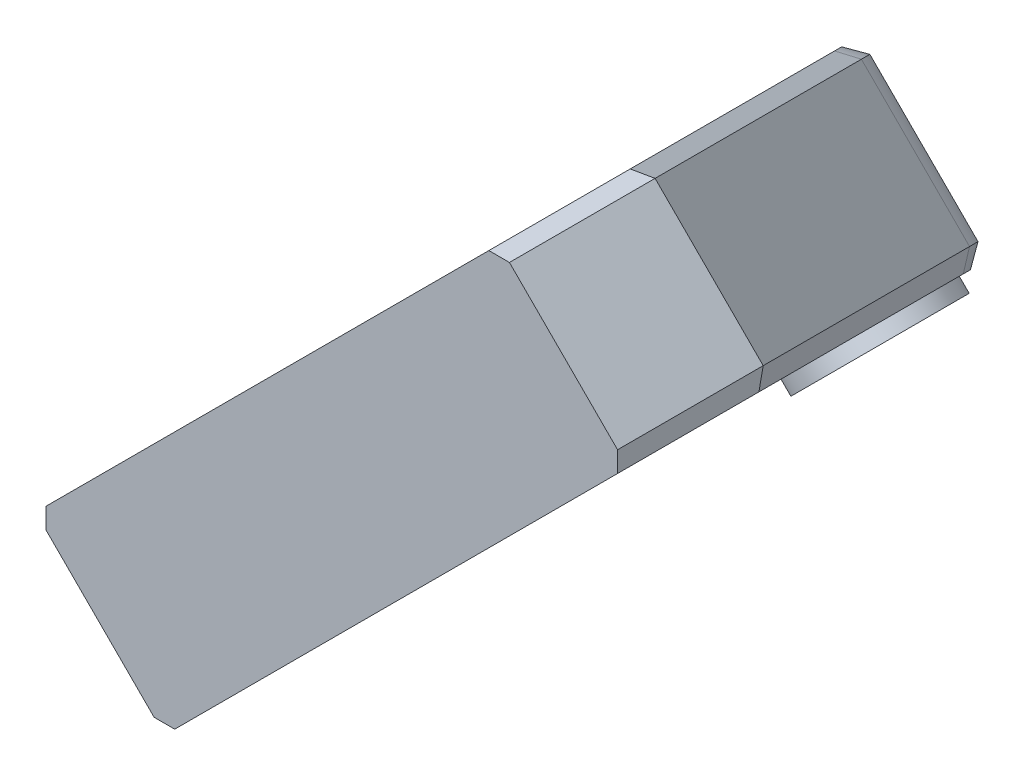
ISO-10303-21;
HEADER;
FILE_DESCRIPTION(('STEP AP214'),'2;1');
FILE_NAME('part.step','',(''),(''),'','','');
FILE_SCHEMA(('AUTOMOTIVE_DESIGN { 1 0 10303 214 1 1 1 1 }'));
ENDSEC;
DATA;
#1=APPLICATION_CONTEXT('core data for automotive mechanical design processes');
#2=APPLICATION_PROTOCOL_DEFINITION('international standard','automotive_design',2000,#1);
#3=PRODUCT_CONTEXT('',#1,'mechanical');
#4=PRODUCT('Part','Part','',(#3));
#5=PRODUCT_RELATED_PRODUCT_CATEGORY('part','',(#4));
#6=PRODUCT_DEFINITION_FORMATION('','',#4);
#7=PRODUCT_DEFINITION_CONTEXT('part definition',#1,'design');
#8=PRODUCT_DEFINITION('design','',#6,#7);
#9=PRODUCT_DEFINITION_SHAPE('','',#8);
#10=(LENGTH_UNIT() NAMED_UNIT(*) SI_UNIT(.MILLI.,.METRE.));
#11=(NAMED_UNIT(*) PLANE_ANGLE_UNIT() SI_UNIT($,.RADIAN.));
#12=(NAMED_UNIT(*) SI_UNIT($,.STERADIAN.) SOLID_ANGLE_UNIT());
#13=UNCERTAINTY_MEASURE_WITH_UNIT(LENGTH_MEASURE(1.E-05),#10,'distance_accuracy_value','');
#14=(GEOMETRIC_REPRESENTATION_CONTEXT(3) GLOBAL_UNCERTAINTY_ASSIGNED_CONTEXT((#13)) GLOBAL_UNIT_ASSIGNED_CONTEXT((#10,
#11,#12)) REPRESENTATION_CONTEXT('',''));
#15=CARTESIAN_POINT('',(0.,0.,0.));
#16=DIRECTION('',(0.,0.,1.));
#17=DIRECTION('',(1.,0.,0.));
#18=AXIS2_PLACEMENT_3D('',#15,#16,#17);
#19=CARTESIAN_POINT('',(-15.077850027277,15.077850027275,-52.4694));
#20=DIRECTION('',(-0.70710678118655,0.707106781186546,0.));
#21=DIRECTION('',(-0.707106781186546,-0.70710678118655,0.));
#22=AXIS2_PLACEMENT_3D('',#19,#20,#21);
#23=PLANE('',#22);
#24=CARTESIAN_POINT('',(-15.0778500272768,15.0778500272749,-47.6815));
#25=DIRECTION('',(-0.707106781186548,0.707106781186548,0.));
#26=DIRECTION('',(-0.707106781186546,-0.70710678118655,0.));
#27=AXIS2_PLACEMENT_3D('',#24,#25,#26);
#28=CIRCLE('',#27,6.35);
#29=CARTESIAN_POINT('',(-19.5679780878114,10.5877219667403,-47.6815));
#30=VERTEX_POINT('',#29);
#31=EDGE_CURVE('E20',#30,#30,#28,.T.);
#32=ORIENTED_EDGE('',*,*,#31,.F.);
#33=EDGE_LOOP('',(#32));
#34=FACE_BOUND('',#33,.T.);
#35=ADVANCED_FACE('F17',(#34),#23,.F.);
#36=CARTESIAN_POINT('',(-46.4728254265348,7.85772410593481,-47.6815));
#37=DIRECTION('',(1.,0.,0.));
#38=DIRECTION('',(0.,0.,1.));
#39=AXIS2_PLACEMENT_3D('',#36,#37,#38);
#40=PLANE('',#39);
#41=DIRECTION('',(0.,-0.978839485677356,-0.20462957088087));
#42=VECTOR('',#41,1.);
#43=CARTESIAN_POINT('',(-46.4728254265345,15.7077075821296,-17.0334651438474));
#44=LINE('',#43,#42);
#45=CARTESIAN_POINT('',(-46.4728254265349,7.85772410593491,-18.674529663271));
#46=VERTEX_POINT('',#45);
#47=CARTESIAN_POINT('',(-46.4728254265349,6.06167288172109,-19.05));
#48=VERTEX_POINT('',#47);
#49=EDGE_CURVE('E11',#46,#48,#44,.T.);
#50=ORIENTED_EDGE('',*,*,#49,.T.);
#51=DIRECTION('',(0.,0.,-1.));
#52=VECTOR('',#51,1.);
#53=CARTESIAN_POINT('',(-46.472825426535,6.06167288172116,-6.34999999999979));
#54=LINE('',#53,#52);
#55=CARTESIAN_POINT('',(-46.472825426535,6.06167288172116,-6.34999999999979));
#56=VERTEX_POINT('',#55);
#57=EDGE_CURVE('E180',#56,#48,#54,.T.);
#58=ORIENTED_EDGE('',*,*,#57,.F.);
#59=DIRECTION('',(0.,-1.,0.));
#60=VECTOR('',#59,1.);
#61=CARTESIAN_POINT('',(-46.4728254265345,36.1455308873032,-6.34999999999977));
#62=LINE('',#61,#60);
#63=CARTESIAN_POINT('',(-46.4728254265349,7.85772410593491,-6.34999999999979));
#64=VERTEX_POINT('',#63);
#65=EDGE_CURVE('E150',#64,#56,#62,.T.);
#66=ORIENTED_EDGE('',*,*,#65,.F.);
#67=DIRECTION('',(0.,0.,1.));
#68=VECTOR('',#67,1.);
#69=CARTESIAN_POINT('',(-46.4728254265348,7.85772410593481,-47.6815));
#70=LINE('',#69,#68);
#71=EDGE_CURVE('E146',#46,#64,#70,.T.);
#72=ORIENTED_EDGE('',*,*,#71,.F.);
#73=EDGE_LOOP('',(#50,#58,#66,#72));
#74=FACE_BOUND('',#73,.T.);
#75=ADVANCED_FACE('F147',(#74),#40,.F.);
#76=CARTESIAN_POINT('',(-31.4038457954448,22.926703737025,-51.5653192299727));
#77=DIRECTION('',(0.919619280319198,-0.0803807196807981,0.3844987895544));
#78=DIRECTION('',(-0.384498789554398,-0.384498789554399,0.839238560638395));
#79=AXIS2_PLACEMENT_3D('',#76,#77,#78);
#80=PLANE('',#79);
#81=DIRECTION('',(0.0803807196808031,-0.919619280319197,-0.3844987895544));
#82=VECTOR('',#81,1.);
#83=CARTESIAN_POINT('',(-31.4038457954448,22.926703737025,-51.5653192299727));
#84=LINE('',#83,#82);
#85=CARTESIAN_POINT('',(-31.4038457954448,22.926703737025,-51.5653192299727));
#86=VERTEX_POINT('',#85);
#87=CARTESIAN_POINT('',(-31.2594779054589,21.2750204027971,-52.2558987516606));
#88=VERTEX_POINT('',#87);
#89=EDGE_CURVE('E27',#86,#88,#84,.T.);
#90=ORIENTED_EDGE('',*,*,#89,.T.);
#91=DIRECTION('',(0.384498789554398,0.384498789554399,-0.839238560638395));
#92=VECTOR('',#91,1.);
#93=CARTESIAN_POINT('',(-46.4728254265349,6.06167288172109,-19.05));
#94=LINE('',#93,#92);
#95=EDGE_CURVE('E140',#48,#88,#94,.T.);
#96=ORIENTED_EDGE('',*,*,#95,.F.);
#97=ORIENTED_EDGE('',*,*,#49,.F.);
#98=DIRECTION('',(-0.384498789554398,-0.384498789554399,0.839238560638395));
#99=VECTOR('',#98,1.);
#100=CARTESIAN_POINT('',(-31.4038457954448,22.926703737025,-51.5653192299727));
#101=LINE('',#100,#99);
#102=EDGE_CURVE('E137',#86,#46,#101,.T.);
#103=ORIENTED_EDGE('',*,*,#102,.F.);
#104=EDGE_LOOP('',(#90,#96,#97,#103));
#105=FACE_BOUND('',#104,.T.);
#106=ADVANCED_FACE('F135',(#105),#80,.F.);
#107=CARTESIAN_POINT('',(-27.1652747662362,27.1652747662336,-47.6815));
#108=DIRECTION('',(0.707106781186548,-0.707106781186548,0.));
#109=DIRECTION('',(0.707106781186546,0.70710678118655,0.));
#110=AXIS2_PLACEMENT_3D('',#107,#108,#109);
#111=CONICAL_SURFACE('',#110,7.14248,0.785398163397448);
#112=DIRECTION('',(0.919619280319197,-0.0803807196808001,-0.3844987895544));
#113=VECTOR('',#112,1.);
#114=CARTESIAN_POINT('',(-22.9267037370276,31.4038457954423,-51.5653192299727));
#115=LINE('',#114,#113);
#116=CARTESIAN_POINT('',(-22.9267037370276,31.4038457954423,-51.5653192299727));
#117=VERTEX_POINT('',#116);
#118=CARTESIAN_POINT('',(-21.2750204027997,31.2594779054564,-52.2558987516606));
#119=VERTEX_POINT('',#118);
#120=EDGE_CURVE('E427',#117,#119,#115,.T.);
#121=ORIENTED_EDGE('',*,*,#120,.T.);
#122=CARTESIAN_POINT('',(-26.2672491541293,26.2672491541267,-47.6815));
#123=DIRECTION('',(0.707106781186548,-0.707106781186548,0.));
#124=DIRECTION('',(-0.707106781186546,-0.70710678118655,0.));
#125=AXIS2_PLACEMENT_3D('',#122,#123,#124);
#126=CIRCLE('',#125,8.41248);
#127=EDGE_CURVE('E445',#88,#119,#126,.T.);
#128=ORIENTED_EDGE('',*,*,#127,.F.);
#129=ORIENTED_EDGE('',*,*,#89,.F.);
#130=CARTESIAN_POINT('',(-27.1652747662362,27.1652747662336,-47.6815));
#131=DIRECTION('',(-0.707106781186548,0.707106781186548,0.));
#132=DIRECTION('',(-0.707106781186546,-0.70710678118655,0.));
#133=AXIS2_PLACEMENT_3D('',#130,#131,#132);
#134=CIRCLE('',#133,7.14248);
#135=EDGE_CURVE('E160',#117,#86,#134,.T.);
#136=ORIENTED_EDGE('',*,*,#135,.F.);
#137=EDGE_LOOP('',(#121,#128,#129,#136));
#138=FACE_BOUND('',#137,.T.);
#139=ADVANCED_FACE('F796',(#138),#111,.T.);
#140=CARTESIAN_POINT('',(-22.9267037370276,31.4038457954423,-51.5653192299727));
#141=DIRECTION('',(0.0803807196808017,-0.919619280319196,0.384498789554402));
#142=DIRECTION('',(-0.384498789554398,-0.384498789554401,-0.839238560638394));
#143=AXIS2_PLACEMENT_3D('',#140,#141,#142);
#144=PLANE('',#143);
#145=DIRECTION('',(0.978839485677355,0.,-0.204629570880876));
#146=VECTOR('',#145,1.);
#147=CARTESIAN_POINT('',(-15.7077075821319,46.472825426532,-17.0334651438469));
#148=LINE('',#147,#146);
#149=CARTESIAN_POINT('',(-7.85772410593714,46.4728254265319,-18.6745296632705));
#150=VERTEX_POINT('',#149);
#151=CARTESIAN_POINT('',(-6.06167288172356,46.4728254265322,-19.05));
#152=VERTEX_POINT('',#151);
#153=EDGE_CURVE('E423',#150,#152,#148,.T.);
#154=ORIENTED_EDGE('',*,*,#153,.T.);
#155=DIRECTION('',(0.384498789554398,0.384498789554401,0.839238560638394));
#156=VECTOR('',#155,1.);
#157=CARTESIAN_POINT('',(-6.06167288172356,46.4728254265322,-19.05));
#158=LINE('',#157,#156);
#159=EDGE_CURVE('E359',#119,#152,#158,.T.);
#160=ORIENTED_EDGE('',*,*,#159,.F.);
#161=ORIENTED_EDGE('',*,*,#120,.F.);
#162=DIRECTION('',(-0.384498789554398,-0.384498789554401,-0.839238560638394));
#163=VECTOR('',#162,1.);
#164=CARTESIAN_POINT('',(-22.9267037370276,31.4038457954423,-51.5653192299727));
#165=LINE('',#164,#163);
#166=EDGE_CURVE('E420',#150,#117,#165,.T.);
#167=ORIENTED_EDGE('',*,*,#166,.F.);
#168=EDGE_LOOP('',(#154,#160,#161,#167));
#169=FACE_BOUND('',#168,.T.);
#170=ADVANCED_FACE('F801',(#169),#144,.F.);
#171=CARTESIAN_POINT('',(-7.85772410593739,46.4728254265322,-47.6815));
#172=DIRECTION('',(0.,-1.,0.));
#173=DIRECTION('',(0.,0.,-1.));
#174=AXIS2_PLACEMENT_3D('',#171,#172,#173);
#175=PLANE('',#174);
#176=DIRECTION('',(-1.,0.,0.));
#177=VECTOR('',#176,1.);
#178=CARTESIAN_POINT('',(4.2656216575057,46.4728254265324,-6.34999999999979));
#179=LINE('',#178,#177);
#180=CARTESIAN_POINT('',(-6.06167288172345,46.472825426532,-6.34999999999979));
#181=VERTEX_POINT('',#180);
#182=CARTESIAN_POINT('',(-7.8577241059373,46.4728254265321,-6.34999999999979));
#183=VERTEX_POINT('',#182);
#184=EDGE_CURVE('E203',#181,#183,#179,.T.);
#185=ORIENTED_EDGE('',*,*,#184,.F.);
#186=DIRECTION('',(0.,0.,1.));
#187=VECTOR('',#186,1.);
#188=CARTESIAN_POINT('',(-6.06167288172345,46.472825426532,-6.34999999999979));
#189=LINE('',#188,#187);
#190=EDGE_CURVE('E398',#152,#181,#189,.T.);
#191=ORIENTED_EDGE('',*,*,#190,.F.);
#192=ORIENTED_EDGE('',*,*,#153,.F.);
#193=DIRECTION('',(0.,0.,-1.));
#194=VECTOR('',#193,1.);
#195=CARTESIAN_POINT('',(-7.85772410593739,46.4728254265322,-47.6815));
#196=LINE('',#195,#194);
#197=EDGE_CURVE('E155',#183,#150,#196,.T.);
#198=ORIENTED_EDGE('',*,*,#197,.F.);
#199=EDGE_LOOP('',(#185,#191,#192,#198));
#200=FACE_BOUND('',#199,.T.);
#201=ADVANCED_FACE('F804',(#200),#175,.F.);
#202=CARTESIAN_POINT('',(-37.0435564994121,-3.36759604540113,-6.34999999999979));
#203=DIRECTION('',(0.,-1.,0.));
#204=DIRECTION('',(0.,0.,-1.));
#205=AXIS2_PLACEMENT_3D('',#202,#203,#204);
#206=PLANE('',#205);
#207=DIRECTION('',(0.978839485677356,0.,0.20462957088087));
#208=VECTOR('',#207,1.);
#209=CARTESIAN_POINT('',(-37.0435564994121,-3.36759604540113,-19.05));
#210=LINE('',#209,#208);
#211=CARTESIAN_POINT('',(-37.0435564994121,-3.36759604540113,-19.05));
#212=VERTEX_POINT('',#211);
#213=CARTESIAN_POINT('',(-35.2475052751983,-3.36759604540114,-18.6745296632711));
#214=VERTEX_POINT('',#213);
#215=EDGE_CURVE('E428',#212,#214,#210,.T.);
#216=ORIENTED_EDGE('',*,*,#215,.T.);
#217=DIRECTION('',(0.,0.,-1.));
#218=VECTOR('',#217,1.);
#219=CARTESIAN_POINT('',(-35.2475052751983,-3.36759604540114,-19.05));
#220=LINE('',#219,#218);
#221=CARTESIAN_POINT('',(-35.2475052751983,-3.36759604540118,-6.34999999999979));
#222=VERTEX_POINT('',#221);
#223=EDGE_CURVE('E316',#222,#214,#220,.T.);
#224=ORIENTED_EDGE('',*,*,#223,.F.);
#225=DIRECTION('',(1.,0.,0.));
#226=VECTOR('',#225,1.);
#227=CARTESIAN_POINT('',(4.26562165750564,-3.36759604540104,-6.34999999999979));
#228=LINE('',#227,#226);
#229=CARTESIAN_POINT('',(-37.0435564994121,-3.36759604540113,-6.34999999999979));
#230=VERTEX_POINT('',#229);
#231=EDGE_CURVE('E381',#230,#222,#228,.T.);
#232=ORIENTED_EDGE('',*,*,#231,.F.);
#233=DIRECTION('',(0.,0.,1.));
#234=VECTOR('',#233,1.);
#235=CARTESIAN_POINT('',(-37.0435564994121,-3.36759604540113,-6.34999999999979));
#236=LINE('',#235,#234);
#237=EDGE_CURVE('E184',#212,#230,#236,.T.);
#238=ORIENTED_EDGE('',*,*,#237,.F.);
#239=EDGE_LOOP('',(#216,#224,#232,#238));
#240=FACE_BOUND('',#239,.T.);
#241=ADVANCED_FACE('F808',(#240),#206,.T.);
#242=CARTESIAN_POINT('',(-37.0435564994121,-3.36759604540113,-19.05));
#243=DIRECTION('',(0.0803807196808031,-0.919619280319197,-0.384498789554399));
#244=DIRECTION('',(0.384498789554398,0.384498789554399,-0.839238560638395));
#245=AXIS2_PLACEMENT_3D('',#242,#243,#244);
#246=PLANE('',#245);
#247=DIRECTION('',(0.919619280319197,-0.0803807196807974,0.384498789554401));
#248=VECTOR('',#247,1.);
#249=CARTESIAN_POINT('',(-21.830208978336,11.8457514756748,-52.2558987516605));
#250=LINE('',#249,#248);
#251=CARTESIAN_POINT('',(-21.830208978336,11.8457514756748,-52.2558987516605));
#252=VERTEX_POINT('',#251);
#253=CARTESIAN_POINT('',(-20.1785256441082,11.701383585689,-51.5653192299726));
#254=VERTEX_POINT('',#253);
#255=EDGE_CURVE('E488',#252,#254,#250,.T.);
#256=ORIENTED_EDGE('',*,*,#255,.T.);
#257=DIRECTION('',(0.384498789554398,0.384498789554399,-0.839238560638395));
#258=VECTOR('',#257,1.);
#259=CARTESIAN_POINT('',(-20.1785256441082,11.701383585689,-51.5653192299726));
#260=LINE('',#259,#258);
#261=EDGE_CURVE('E492',#214,#254,#260,.T.);
#262=ORIENTED_EDGE('',*,*,#261,.F.);
#263=ORIENTED_EDGE('',*,*,#215,.F.);
#264=DIRECTION('',(-0.384498789554398,-0.384498789554399,0.839238560638395));
#265=VECTOR('',#264,1.);
#266=CARTESIAN_POINT('',(-37.0435564994121,-3.36759604540113,-19.05));
#267=LINE('',#266,#265);
#268=EDGE_CURVE('E462',#252,#212,#267,.T.);
#269=ORIENTED_EDGE('',*,*,#268,.F.);
#270=EDGE_LOOP('',(#256,#262,#263,#269));
#271=FACE_BOUND('',#270,.T.);
#272=ADVANCED_FACE('F812',(#271),#246,.T.);
#273=CARTESIAN_POINT('',(-16.8379802270064,16.8379802270044,-47.6815));
#274=DIRECTION('',(-0.707106781186548,0.707106781186548,0.));
#275=DIRECTION('',(-0.707106781186546,-0.70710678118655,0.));
#276=AXIS2_PLACEMENT_3D('',#273,#274,#275);
#277=CONICAL_SURFACE('',#276,8.41248,0.785398163397451);
#278=DIRECTION('',(0.0803807196808011,-0.919619280319198,0.384498789554398));
#279=VECTOR('',#278,1.);
#280=CARTESIAN_POINT('',(-11.8457514756768,21.830208978334,-52.2558987516605));
#281=LINE('',#280,#279);
#282=CARTESIAN_POINT('',(-11.8457514756768,21.830208978334,-52.2558987516605));
#283=VERTEX_POINT('',#282);
#284=CARTESIAN_POINT('',(-11.701383585691,20.1785256441062,-51.5653192299726));
#285=VERTEX_POINT('',#284);
#286=EDGE_CURVE('E513',#283,#285,#281,.T.);
#287=ORIENTED_EDGE('',*,*,#286,.T.);
#288=CARTESIAN_POINT('',(-15.9399546148995,15.9399546148976,-47.6815));
#289=DIRECTION('',(0.707106781186548,-0.707106781186548,0.));
#290=DIRECTION('',(-0.707106781186546,-0.70710678118655,0.));
#291=AXIS2_PLACEMENT_3D('',#288,#289,#290);
#292=CIRCLE('',#291,7.14248);
#293=EDGE_CURVE('E500',#254,#285,#292,.T.);
#294=ORIENTED_EDGE('',*,*,#293,.F.);
#295=ORIENTED_EDGE('',*,*,#255,.F.);
#296=CARTESIAN_POINT('',(-16.8379802270064,16.8379802270044,-47.6815));
#297=DIRECTION('',(-0.707106781186548,0.707106781186548,0.));
#298=DIRECTION('',(-0.707106781186546,-0.70710678118655,0.));
#299=AXIS2_PLACEMENT_3D('',#296,#297,#298);
#300=CIRCLE('',#299,8.41248);
#301=EDGE_CURVE('E449',#283,#252,#300,.T.);
#302=ORIENTED_EDGE('',*,*,#301,.F.);
#303=EDGE_LOOP('',(#287,#294,#295,#302));
#304=FACE_BOUND('',#303,.T.);
#305=ADVANCED_FACE('F816',(#304),#277,.T.);
#306=CARTESIAN_POINT('',(3.36759604539899,37.0435564994102,-19.05));
#307=DIRECTION('',(0.919619280319198,-0.0803807196807994,-0.384498789554399));
#308=DIRECTION('',(0.384498789554398,0.384498789554401,0.839238560638394));
#309=AXIS2_PLACEMENT_3D('',#306,#307,#308);
#310=PLANE('',#309);
#311=DIRECTION('',(0.,-0.978839485677356,0.204629570880869));
#312=VECTOR('',#311,1.);
#313=CARTESIAN_POINT('',(3.3675960453992,34.4997527996844,-18.5182095817576));
#314=LINE('',#313,#312);
#315=CARTESIAN_POINT('',(3.36759604539899,37.0435564994102,-19.05));
#316=VERTEX_POINT('',#315);
#317=CARTESIAN_POINT('',(3.3675960453992,35.2475052751963,-18.6745296632705));
#318=VERTEX_POINT('',#317);
#319=EDGE_CURVE('E365',#316,#318,#314,.T.);
#320=ORIENTED_EDGE('',*,*,#319,.T.);
#321=DIRECTION('',(0.384498789554398,0.384498789554401,0.839238560638394));
#322=VECTOR('',#321,1.);
#323=CARTESIAN_POINT('',(3.51196393538507,35.3918731651821,-18.3594204783116));
#324=LINE('',#323,#322);
#325=EDGE_CURVE('E506',#285,#318,#324,.T.);
#326=ORIENTED_EDGE('',*,*,#325,.F.);
#327=ORIENTED_EDGE('',*,*,#286,.F.);
#328=DIRECTION('',(-0.384498789554398,-0.384498789554401,-0.839238560638394));
#329=VECTOR('',#328,1.);
#330=CARTESIAN_POINT('',(-11.8457514756768,21.830208978334,-52.2558987516605));
#331=LINE('',#330,#329);
#332=EDGE_CURVE('E433',#316,#283,#331,.T.);
#333=ORIENTED_EDGE('',*,*,#332,.F.);
#334=EDGE_LOOP('',(#320,#326,#327,#333));
#335=FACE_BOUND('',#334,.T.);
#336=ADVANCED_FACE('F820',(#335),#310,.T.);
#337=CARTESIAN_POINT('',(3.3675960453992,37.04355649941,-6.34999999999979));
#338=DIRECTION('',(1.,0.,0.));
#339=DIRECTION('',(0.,0.,1.));
#340=AXIS2_PLACEMENT_3D('',#337,#338,#339);
#341=PLANE('',#340);
#342=DIRECTION('',(0.,1.,0.));
#343=VECTOR('',#342,1.);
#344=CARTESIAN_POINT('',(3.36759604539924,36.1455308873032,-6.34999999999979));
#345=LINE('',#344,#343);
#346=CARTESIAN_POINT('',(3.36759604539924,35.2475052751963,-6.34999999999979));
#347=VERTEX_POINT('',#346);
#348=CARTESIAN_POINT('',(3.3675960453992,37.04355649941,-6.34999999999979));
#349=VERTEX_POINT('',#348);
#350=EDGE_CURVE('E211',#347,#349,#345,.T.);
#351=ORIENTED_EDGE('',*,*,#350,.F.);
#352=DIRECTION('',(0.,0.,1.));
#353=VECTOR('',#352,1.);
#354=CARTESIAN_POINT('',(3.36759604539924,35.2475052751963,-6.34999999999979));
#355=LINE('',#354,#353);
#356=EDGE_CURVE('E533',#318,#347,#355,.T.);
#357=ORIENTED_EDGE('',*,*,#356,.F.);
#358=ORIENTED_EDGE('',*,*,#319,.F.);
#359=DIRECTION('',(0.,0.,-1.));
#360=VECTOR('',#359,1.);
#361=CARTESIAN_POINT('',(3.36759604539899,37.0435564994102,-19.05));
#362=LINE('',#361,#360);
#363=EDGE_CURVE('E540',#349,#316,#362,.T.);
#364=ORIENTED_EDGE('',*,*,#363,.F.);
#365=EDGE_LOOP('',(#351,#357,#358,#364));
#366=FACE_BOUND('',#365,.T.);
#367=ADVANCED_FACE('F824',(#366),#341,.T.);
#368=CARTESIAN_POINT('',(-9.20675771562303,24.4692027383882,-10.1599999999998));
#369=DIRECTION('',(-0.5,0.5,0.707106781186547));
#370=DIRECTION('',(-0.707106781186546,-0.70710678118655,0.));
#371=AXIS2_PLACEMENT_3D('',#368,#369,#370);
#372=PLANE('',#371);
#373=DIRECTION('',(-0.5,0.5,-0.707106781186551));
#374=VECTOR('',#373,1.);
#375=CARTESIAN_POINT('',(-23.5711771262831,8.30873210351414,-8.88999999999977));
#376=LINE('',#375,#374);
#377=CARTESIAN_POINT('',(-23.5711771262831,8.30873210351414,-8.88999999999977));
#378=VERTEX_POINT('',#377);
#379=CARTESIAN_POINT('',(-24.46920273839,9.20675771562103,-10.1599999999998));
#380=VERTEX_POINT('',#379);
#381=EDGE_CURVE('E321',#378,#380,#376,.T.);
#382=ORIENTED_EDGE('',*,*,#381,.T.);
#383=DIRECTION('',(-0.707106781186546,-0.70710678118655,0.));
#384=VECTOR('',#383,1.);
#385=CARTESIAN_POINT('',(-9.20675771562303,24.4692027383882,-10.1599999999998));
#386=LINE('',#385,#384);
#387=CARTESIAN_POINT('',(-9.20675771562303,24.4692027383882,-10.1599999999998));
#388=VERTEX_POINT('',#387);
#389=EDGE_CURVE('E252',#388,#380,#386,.T.);
#390=ORIENTED_EDGE('',*,*,#389,.F.);
#391=DIRECTION('',(-0.5,0.5,-0.707106781186551));
#392=VECTOR('',#391,1.);
#393=CARTESIAN_POINT('',(-8.30873210351611,23.5711771262813,-8.88999999999977));
#394=LINE('',#393,#392);
#395=CARTESIAN_POINT('',(-8.30873210351611,23.5711771262813,-8.88999999999977));
#396=VERTEX_POINT('',#395);
#397=EDGE_CURVE('E225',#396,#388,#394,.T.);
#398=ORIENTED_EDGE('',*,*,#397,.F.);
#399=DIRECTION('',(0.707106781186546,0.70710678118655,0.));
#400=VECTOR('',#399,1.);
#401=CARTESIAN_POINT('',(-15.9399546148997,15.9399546148978,-8.88999999999977));
#402=LINE('',#401,#400);
#403=EDGE_CURVE('E327',#378,#396,#402,.T.);
#404=ORIENTED_EDGE('',*,*,#403,.F.);
#405=EDGE_LOOP('',(#382,#390,#398,#404));
#406=FACE_BOUND('',#405,.T.);
#407=ADVANCED_FACE('F828',(#406),#372,.F.);
#408=CARTESIAN_POINT('',(-14.1248124273708,19.5511480266402,-33.8746177688179));
#409=DIRECTION('',(-0.0803807196808053,0.919619280319197,-0.3844987895544));
#410=DIRECTION('',(0.384498789554398,0.384498789554401,0.839238560638394));
#411=AXIS2_PLACEMENT_3D('',#408,#409,#410);
#412=PLANE('',#411);
#413=DIRECTION('',(0.919619280319198,-0.0803807196807965,-0.384498789554401));
#414=VECTOR('',#413,1.);
#415=CARTESIAN_POINT('',(-14.1248124273708,19.5511480266402,-33.8746177688179));
#416=LINE('',#415,#414);
#417=CARTESIAN_POINT('',(-14.1248124273708,19.5511480266402,-33.8746177688179));
#418=VERTEX_POINT('',#417);
#419=CARTESIAN_POINT('',(-12.4731290931428,19.4067801366543,-34.5651972905057));
#420=VERTEX_POINT('',#419);
#421=EDGE_CURVE('E288',#418,#420,#416,.T.);
#422=ORIENTED_EDGE('',*,*,#421,.T.);
#423=DIRECTION('',(-0.384498789554398,-0.384498789554401,-0.839238560638394));
#424=VECTOR('',#423,1.);
#425=CARTESIAN_POINT('',(-17.730645362659,14.149263867138,-46.0406830564693));
#426=LINE('',#425,#424);
#427=CARTESIAN_POINT('',(-4.84190658175937,27.0380026480378,-17.9086657997639));
#428=VERTEX_POINT('',#427);
#429=EDGE_CURVE('E294',#428,#420,#426,.T.);
#430=ORIENTED_EDGE('',*,*,#429,.F.);
#431=DIRECTION('',(0.919619280319197,-0.0803807196807958,-0.384498789554402));
#432=VECTOR('',#431,1.);
#433=CARTESIAN_POINT('',(-6.49358991598729,27.1823705380237,-17.218086278076));
#434=LINE('',#433,#432);
#435=CARTESIAN_POINT('',(-6.49358991598729,27.1823705380237,-17.218086278076));
#436=VERTEX_POINT('',#435);
#437=EDGE_CURVE('E341',#436,#428,#434,.T.);
#438=ORIENTED_EDGE('',*,*,#437,.F.);
#439=DIRECTION('',(0.384498789554398,0.384498789554401,0.839238560638394));
#440=VECTOR('',#439,1.);
#441=CARTESIAN_POINT('',(-14.1248124273708,19.5511480266402,-33.8746177688179));
#442=LINE('',#441,#440);
#443=EDGE_CURVE('E330',#418,#436,#442,.T.);
#444=ORIENTED_EDGE('',*,*,#443,.F.);
#445=EDGE_LOOP('',(#422,#430,#438,#444));
#446=FACE_BOUND('',#445,.T.);
#447=ADVANCED_FACE('F738',(#446),#412,.F.);
#448=CARTESIAN_POINT('',(-24.4692027383899,9.20675771562106,-14.7319999999998));
#449=DIRECTION('',(0.707106781186548,-0.707106781186548,0.));
#450=DIRECTION('',(0.707106781186546,0.70710678118655,0.));
#451=AXIS2_PLACEMENT_3D('',#448,#449,#450);
#452=CONICAL_SURFACE('',#451,4.572,0.78539816339745);
#453=DIRECTION('',(-0.0803807196807996,0.919619280319197,0.384498789554402));
#454=VECTOR('',#453,1.);
#455=CARTESIAN_POINT('',(-27.0380026480395,4.84190658175702,-17.9086657997644));
#456=LINE('',#455,#454);
#457=CARTESIAN_POINT('',(-27.0380026480395,4.84190658175702,-17.9086657997644));
#458=VERTEX_POINT('',#457);
#459=CARTESIAN_POINT('',(-27.1823705380255,6.49358991598525,-17.2180862780765));
#460=VERTEX_POINT('',#459);
#461=EDGE_CURVE('E245',#458,#460,#456,.T.);
#462=ORIENTED_EDGE('',*,*,#461,.T.);
#463=CARTESIAN_POINT('',(-24.4692027383899,9.20675771562106,-14.7319999999998));
#464=DIRECTION('',(0.707106781186548,-0.707106781186548,0.));
#465=DIRECTION('',(-0.707106781186546,-0.70710678118655,0.));
#466=AXIS2_PLACEMENT_3D('',#463,#464,#465);
#467=CIRCLE('',#466,4.572);
#468=EDGE_CURVE('E253',#380,#460,#467,.T.);
#469=ORIENTED_EDGE('',*,*,#468,.F.);
#470=ORIENTED_EDGE('',*,*,#381,.F.);
#471=CARTESIAN_POINT('',(-23.5711771262831,8.30873210351411,-14.7319999999998));
#472=DIRECTION('',(-0.707106781186548,0.707106781186548,0.));
#473=DIRECTION('',(-0.707106781186546,-0.70710678118655,0.));
#474=AXIS2_PLACEMENT_3D('',#471,#472,#473);
#475=CIRCLE('',#474,5.842);
#476=EDGE_CURVE('E275',#458,#378,#475,.T.);
#477=ORIENTED_EDGE('',*,*,#476,.F.);
#478=EDGE_LOOP('',(#462,#469,#470,#477));
#479=FACE_BOUND('',#478,.T.);
#480=ADVANCED_FACE('F766',(#479),#452,.F.);
#481=CARTESIAN_POINT('',(-16.8379802270064,16.8379802270044,-31.3885314907415));
#482=DIRECTION('',(0.707106781186548,-0.707106781186548,0.));
#483=DIRECTION('',(0.707106781186546,0.70710678118655,0.));
#484=AXIS2_PLACEMENT_3D('',#481,#482,#483);
#485=CONICAL_SURFACE('',#484,4.572,0.78539816339745);
#486=DIRECTION('',(0.0803807196807996,-0.919619280319197,-0.384498789554401));
#487=VECTOR('',#486,1.);
#488=CARTESIAN_POINT('',(-19.5511480266421,14.1248124273689,-33.8746177688179));
#489=LINE('',#488,#487);
#490=CARTESIAN_POINT('',(-19.5511480266421,14.1248124273689,-33.8746177688179));
#491=VERTEX_POINT('',#490);
#492=CARTESIAN_POINT('',(-19.4067801366562,12.4731290931409,-34.5651972905056));
#493=VERTEX_POINT('',#492);
#494=EDGE_CURVE('E40',#491,#493,#489,.T.);
#495=ORIENTED_EDGE('',*,*,#494,.T.);
#496=CARTESIAN_POINT('',(-15.9399546148995,15.9399546148976,-31.3885314907415));
#497=DIRECTION('',(-0.707106781186548,0.707106781186548,0.));
#498=DIRECTION('',(-0.707106781186546,-0.70710678118655,0.));
#499=AXIS2_PLACEMENT_3D('',#496,#497,#498);
#500=CIRCLE('',#499,5.842);
#501=EDGE_CURVE('E276',#420,#493,#500,.T.);
#502=ORIENTED_EDGE('',*,*,#501,.F.);
#503=ORIENTED_EDGE('',*,*,#421,.F.);
#504=CARTESIAN_POINT('',(-16.8379802270064,16.8379802270044,-31.3885314907415));
#505=DIRECTION('',(0.707106781186548,-0.707106781186548,0.));
#506=DIRECTION('',(-0.707106781186546,-0.70710678118655,0.));
#507=AXIS2_PLACEMENT_3D('',#504,#505,#506);
#508=CIRCLE('',#507,4.572);
#509=EDGE_CURVE('E297',#491,#418,#508,.T.);
#510=ORIENTED_EDGE('',*,*,#509,.F.);
#511=EDGE_LOOP('',(#495,#502,#503,#510));
#512=FACE_BOUND('',#511,.T.);
#513=ADVANCED_FACE('F729',(#512),#485,.F.);
#514=CARTESIAN_POINT('',(-27.1823705380255,6.49358991598525,-17.2180862780765));
#515=DIRECTION('',(-0.919619280319198,0.0803807196808016,-0.384498789554398));
#516=DIRECTION('',(0.384498789554397,0.384498789554399,-0.839238560638395));
#517=AXIS2_PLACEMENT_3D('',#514,#515,#516);
#518=PLANE('',#517);
#519=ORIENTED_EDGE('',*,*,#461,.F.);
#520=DIRECTION('',(-0.384498789554397,-0.384498789554399,0.839238560638395));
#521=VECTOR('',#520,1.);
#522=CARTESIAN_POINT('',(-14.1492638671399,17.7306453626571,-46.0406830564693));
#523=LINE('',#522,#521);
#524=EDGE_CURVE('E271',#493,#458,#523,.T.);
#525=ORIENTED_EDGE('',*,*,#524,.F.);
#526=ORIENTED_EDGE('',*,*,#494,.F.);
#527=DIRECTION('',(0.384498789554397,0.384498789554399,-0.839238560638395));
#528=VECTOR('',#527,1.);
#529=CARTESIAN_POINT('',(-27.1823705380255,6.49358991598525,-17.2180862780765));
#530=LINE('',#529,#528);
#531=EDGE_CURVE('E279',#460,#491,#530,.T.);
#532=ORIENTED_EDGE('',*,*,#531,.F.);
#533=EDGE_LOOP('',(#519,#525,#526,#532));
#534=FACE_BOUND('',#533,.T.);
#535=ADVANCED_FACE('F758',(#534),#518,.F.);
#536=CARTESIAN_POINT('',(-27.1652747662364,27.1652747662337,-8.88999999999977));
#537=DIRECTION('',(-0.5,0.5,-0.707106781186551));
#538=DIRECTION('',(0.707106781186546,0.70710678118655,0.));
#539=AXIS2_PLACEMENT_3D('',#536,#537,#538);
#540=PLANE('',#539);
#541=DIRECTION('',(0.5,-0.5,-0.707106781186548));
#542=VECTOR('',#541,1.);
#543=CARTESIAN_POINT('',(-19.5340522548527,34.7964972776171,-8.88999999999977));
#544=LINE('',#543,#542);
#545=CARTESIAN_POINT('',(-19.5340522548527,34.7964972776171,-8.88999999999977));
#546=VERTEX_POINT('',#545);
#547=CARTESIAN_POINT('',(-18.6360266427458,33.8984716655103,-10.1599999999998));
#548=VERTEX_POINT('',#547);
#549=EDGE_CURVE('E237',#546,#548,#544,.T.);
#550=ORIENTED_EDGE('',*,*,#549,.T.);
#551=DIRECTION('',(0.707106781186546,0.70710678118655,0.));
#552=VECTOR('',#551,1.);
#553=CARTESIAN_POINT('',(-18.6360266427458,33.8984716655103,-10.1599999999998));
#554=LINE('',#553,#552);
#555=CARTESIAN_POINT('',(-33.8984716655129,18.6360266427432,-10.1599999999998));
#556=VERTEX_POINT('',#555);
#557=EDGE_CURVE('E248',#556,#548,#554,.T.);
#558=ORIENTED_EDGE('',*,*,#557,.F.);
#559=DIRECTION('',(-0.5,0.5,0.707106781186548));
#560=VECTOR('',#559,1.);
#561=CARTESIAN_POINT('',(-33.8984716655129,18.6360266427432,-10.1599999999998));
#562=LINE('',#561,#560);
#563=CARTESIAN_POINT('',(-34.7964972776198,19.53405225485,-8.88999999999977));
#564=VERTEX_POINT('',#563);
#565=EDGE_CURVE('E256',#556,#564,#562,.T.);
#566=ORIENTED_EDGE('',*,*,#565,.T.);
#567=DIRECTION('',(-0.707106781186546,-0.70710678118655,0.));
#568=VECTOR('',#567,1.);
#569=CARTESIAN_POINT('',(-34.7964972776198,19.53405225485,-8.88999999999977));
#570=LINE('',#569,#568);
#571=EDGE_CURVE('E263',#546,#564,#570,.T.);
#572=ORIENTED_EDGE('',*,*,#571,.F.);
#573=EDGE_LOOP('',(#550,#558,#566,#572));
#574=FACE_BOUND('',#573,.T.);
#575=ADVANCED_FACE('F840',(#574),#540,.T.);
#576=CARTESIAN_POINT('',(-19.5340522548527,34.7964972776171,-14.7319999999998));
#577=DIRECTION('',(-0.707106781186548,0.707106781186548,0.));
#578=DIRECTION('',(-0.707106781186546,-0.70710678118655,0.));
#579=AXIS2_PLACEMENT_3D('',#576,#577,#578);
#580=CONICAL_SURFACE('',#579,5.842,0.785398163397446);
#581=DIRECTION('',(0.0803807196808024,-0.919619280319198,0.384498789554399));
#582=VECTOR('',#581,1.);
#583=CARTESIAN_POINT('',(-16.067226733096,38.2633227993738,-17.9086657997638));
#584=LINE('',#583,#582);
#585=CARTESIAN_POINT('',(-16.067226733096,38.2633227993738,-17.9086657997638));
#586=VERTEX_POINT('',#585);
#587=CARTESIAN_POINT('',(-15.9228588431101,36.6116394651458,-17.2180862780759));
#588=VERTEX_POINT('',#587);
#589=EDGE_CURVE('E238',#586,#588,#584,.T.);
#590=ORIENTED_EDGE('',*,*,#589,.T.);
#591=CARTESIAN_POINT('',(-18.6360266427458,33.8984716655103,-14.7319999999998));
#592=DIRECTION('',(-0.707106781186548,0.707106781186548,0.));
#593=DIRECTION('',(-0.707106781186546,-0.70710678118655,0.));
#594=AXIS2_PLACEMENT_3D('',#591,#592,#593);
#595=CIRCLE('',#594,4.572);
#596=EDGE_CURVE('E260',#548,#588,#595,.T.);
#597=ORIENTED_EDGE('',*,*,#596,.F.);
#598=ORIENTED_EDGE('',*,*,#549,.F.);
#599=CARTESIAN_POINT('',(-19.5340522548527,34.7964972776171,-14.7319999999998));
#600=DIRECTION('',(0.707106781186548,-0.707106781186548,0.));
#601=DIRECTION('',(-0.707106781186546,-0.70710678118655,0.));
#602=AXIS2_PLACEMENT_3D('',#599,#600,#601);
#603=CIRCLE('',#602,5.842);
#604=EDGE_CURVE('E268',#586,#546,#603,.T.);
#605=ORIENTED_EDGE('',*,*,#604,.F.);
#606=EDGE_LOOP('',(#590,#597,#598,#605));
#607=FACE_BOUND('',#606,.T.);
#608=ADVANCED_FACE('F843',(#607),#580,.F.);
#609=CARTESIAN_POINT('',(-25.3745840184767,28.9559655139931,-46.0406830564693));
#610=DIRECTION('',(-0.0803807196808002,0.919619280319197,0.3844987895544));
#611=DIRECTION('',(-0.384498789554397,-0.384498789554399,0.839238560638395));
#612=AXIS2_PLACEMENT_3D('',#609,#610,#611);
#613=PLANE('',#612);
#614=DIRECTION('',(-0.919619280319197,0.0803807196808016,-0.3844987895544));
#615=VECTOR('',#614,1.);
#616=CARTESIAN_POINT('',(-28.980416953765,23.5540813544911,-33.8746177688179));
#617=LINE('',#616,#615);
#618=CARTESIAN_POINT('',(-28.980416953765,23.5540813544911,-33.8746177688179));
#619=VERTEX_POINT('',#618);
#620=CARTESIAN_POINT('',(-30.632100287993,23.6984492444769,-34.5651972905059));
#621=VERTEX_POINT('',#620);
#622=EDGE_CURVE('E282',#619,#621,#617,.T.);
#623=ORIENTED_EDGE('',*,*,#622,.T.);
#624=DIRECTION('',(0.384498789554397,0.384498789554399,-0.839238560638395));
#625=VECTOR('',#624,1.);
#626=CARTESIAN_POINT('',(-30.632100287993,23.6984492444769,-34.5651972905059));
#627=LINE('',#626,#625);
#628=CARTESIAN_POINT('',(-38.2633227993758,16.0672267330932,-17.9086657997644));
#629=VERTEX_POINT('',#628);
#630=EDGE_CURVE('E267',#629,#621,#627,.T.);
#631=ORIENTED_EDGE('',*,*,#630,.F.);
#632=DIRECTION('',(-0.919619280319198,0.0803807196808002,-0.384498789554399));
#633=VECTOR('',#632,1.);
#634=CARTESIAN_POINT('',(-36.6116394651483,15.9228588431074,-17.2180862780765));
#635=LINE('',#634,#633);
#636=CARTESIAN_POINT('',(-36.6116394651483,15.9228588431074,-17.2180862780765));
#637=VERTEX_POINT('',#636);
#638=EDGE_CURVE('E233',#637,#629,#635,.T.);
#639=ORIENTED_EDGE('',*,*,#638,.F.);
#640=DIRECTION('',(-0.384498789554397,-0.384498789554399,0.839238560638395));
#641=VECTOR('',#640,1.);
#642=CARTESIAN_POINT('',(-36.6116394651483,15.9228588431074,-17.2180862780765));
#643=LINE('',#642,#641);
#644=EDGE_CURVE('E283',#619,#637,#643,.T.);
#645=ORIENTED_EDGE('',*,*,#644,.F.);
#646=EDGE_LOOP('',(#623,#631,#639,#645));
#647=FACE_BOUND('',#646,.T.);
#648=ADVANCED_FACE('F754',(#647),#613,.T.);
#649=CARTESIAN_POINT('',(-28.9559655139957,25.3745840184741,-46.0406830564693));
#650=DIRECTION('',(-0.919619280319198,0.080380719680798,0.3844987895544));
#651=DIRECTION('',(-0.384498789554398,-0.384498789554401,-0.839238560638394));
#652=AXIS2_PLACEMENT_3D('',#649,#650,#651);
#653=PLANE('',#652);
#654=DIRECTION('',(0.0803807196808039,-0.919619280319198,0.384498789554397));
#655=VECTOR('',#654,1.);
#656=CARTESIAN_POINT('',(-23.6984492444795,30.6321002879904,-34.5651972905059));
#657=LINE('',#656,#655);
#658=CARTESIAN_POINT('',(-23.6984492444795,30.6321002879904,-34.5651972905059));
#659=VERTEX_POINT('',#658);
#660=CARTESIAN_POINT('',(-23.5540813544937,28.9804169537624,-33.8746177688179));
#661=VERTEX_POINT('',#660);
#662=EDGE_CURVE('E568',#659,#661,#657,.T.);
#663=ORIENTED_EDGE('',*,*,#662,.T.);
#664=DIRECTION('',(-0.384498789554398,-0.384498789554401,-0.839238560638394));
#665=VECTOR('',#664,1.);
#666=CARTESIAN_POINT('',(-23.5540813544937,28.9804169537624,-33.8746177688179));
#667=LINE('',#666,#665);
#668=EDGE_CURVE('E587',#588,#661,#667,.T.);
#669=ORIENTED_EDGE('',*,*,#668,.F.);
#670=ORIENTED_EDGE('',*,*,#589,.F.);
#671=DIRECTION('',(0.384498789554398,0.384498789554401,0.839238560638394));
#672=VECTOR('',#671,1.);
#673=CARTESIAN_POINT('',(-16.067226733096,38.2633227993738,-17.9086657997638));
#674=LINE('',#673,#672);
#675=EDGE_CURVE('E162',#659,#586,#674,.T.);
#676=ORIENTED_EDGE('',*,*,#675,.F.);
#677=EDGE_LOOP('',(#663,#669,#670,#676));
#678=FACE_BOUND('',#677,.T.);
#679=ADVANCED_FACE('F744',(#678),#653,.T.);
#680=CARTESIAN_POINT('',(-27.1652747662362,27.1652747662336,-31.3885314907415));
#681=DIRECTION('',(-0.707106781186548,0.707106781186548,0.));
#682=DIRECTION('',(-0.707106781186546,-0.70710678118655,0.));
#683=AXIS2_PLACEMENT_3D('',#680,#681,#682);
#684=CONICAL_SURFACE('',#683,5.842,0.785398163397446);
#685=ORIENTED_EDGE('',*,*,#622,.F.);
#686=CARTESIAN_POINT('',(-26.2672491541293,26.2672491541267,-31.3885314907415));
#687=DIRECTION('',(-0.707106781186548,0.707106781186548,0.));
#688=DIRECTION('',(-0.707106781186546,-0.70710678118655,0.));
#689=AXIS2_PLACEMENT_3D('',#686,#687,#688);
#690=CIRCLE('',#689,4.572);
#691=EDGE_CURVE('E334',#661,#619,#690,.T.);
#692=ORIENTED_EDGE('',*,*,#691,.F.);
#693=ORIENTED_EDGE('',*,*,#662,.F.);
#694=CARTESIAN_POINT('',(-27.1652747662362,27.1652747662336,-31.3885314907415));
#695=DIRECTION('',(0.707106781186548,-0.707106781186548,0.));
#696=DIRECTION('',(-0.707106781186546,-0.70710678118655,0.));
#697=AXIS2_PLACEMENT_3D('',#694,#695,#696);
#698=CIRCLE('',#697,5.842);
#699=EDGE_CURVE('E170',#621,#659,#698,.T.);
#700=ORIENTED_EDGE('',*,*,#699,.F.);
#701=EDGE_LOOP('',(#685,#692,#693,#700));
#702=FACE_BOUND('',#701,.T.);
#703=ADVANCED_FACE('F749',(#702),#684,.F.);
#704=CARTESIAN_POINT('',(-37.5096650772552,16.8208844552142,-17.2180862780765));
#705=DIRECTION('',(-0.593431277260645,-0.593431277260649,-0.543763402903868));
#706=DIRECTION('',(-0.384498789554397,-0.384498789554399,0.839238560638395));
#707=AXIS2_PLACEMENT_3D('',#704,#705,#706);
#708=PLANE('',#707);
#709=DIRECTION('',(0.707106781186548,-0.707106781186548,0.));
#710=VECTOR('',#709,1.);
#711=CARTESIAN_POINT('',(-29.8784425658719,24.4521069665979,-33.8746177688179));
#712=LINE('',#711,#710);
#713=EDGE_CURVE('E301',#619,#491,#712,.T.);
#714=ORIENTED_EDGE('',*,*,#713,.F.);
#715=ORIENTED_EDGE('',*,*,#644,.T.);
#716=DIRECTION('',(0.707106781186548,-0.707106781186548,0.));
#717=VECTOR('',#716,1.);
#718=CARTESIAN_POINT('',(-37.5096650772552,16.8208844552142,-17.2180862780765));
#719=LINE('',#718,#717);
#720=EDGE_CURVE('E454',#637,#460,#719,.T.);
#721=ORIENTED_EDGE('',*,*,#720,.T.);
#722=ORIENTED_EDGE('',*,*,#531,.T.);
#723=EDGE_LOOP('',(#714,#715,#721,#722));
#724=FACE_BOUND('',#723,.T.);
#725=ADVANCED_FACE('F757',(#724),#708,.F.);
#726=CARTESIAN_POINT('',(-27.1652747662362,27.1652747662336,-31.3885314907415));
#727=DIRECTION('',(0.707106781186548,-0.707106781186548,0.));
#728=DIRECTION('',(0.707106781186546,0.70710678118655,0.));
#729=AXIS2_PLACEMENT_3D('',#726,#727,#728);
#730=CYLINDRICAL_SURFACE('',#729,4.572);
#731=DIRECTION('',(0.707106781186548,-0.707106781186548,0.));
#732=VECTOR('',#731,1.);
#733=CARTESIAN_POINT('',(-24.4521069666005,29.8784425658693,-33.8746177688179));
#734=LINE('',#733,#732);
#735=EDGE_CURVE('E335',#661,#418,#734,.T.);
#736=ORIENTED_EDGE('',*,*,#735,.F.);
#737=ORIENTED_EDGE('',*,*,#691,.T.);
#738=ORIENTED_EDGE('',*,*,#713,.T.);
#739=ORIENTED_EDGE('',*,*,#509,.T.);
#740=EDGE_LOOP('',(#736,#737,#738,#739));
#741=FACE_BOUND('',#740,.T.);
#742=ADVANCED_FACE('F735',(#741),#730,.F.);
#743=CARTESIAN_POINT('',(-24.4521069666005,29.8784425658693,-33.8746177688179));
#744=DIRECTION('',(0.593431277260645,0.593431277260647,-0.54376340290387));
#745=DIRECTION('',(-0.384498789554398,-0.384498789554401,-0.839238560638394));
#746=AXIS2_PLACEMENT_3D('',#743,#744,#745);
#747=PLANE('',#746);
#748=DIRECTION('',(0.707106781186548,-0.707106781186548,0.));
#749=VECTOR('',#748,1.);
#750=CARTESIAN_POINT('',(-16.820884455217,37.5096650772528,-17.2180862780759));
#751=LINE('',#750,#749);
#752=EDGE_CURVE('E347',#588,#436,#751,.T.);
#753=ORIENTED_EDGE('',*,*,#752,.F.);
#754=ORIENTED_EDGE('',*,*,#668,.T.);
#755=ORIENTED_EDGE('',*,*,#735,.T.);
#756=ORIENTED_EDGE('',*,*,#443,.T.);
#757=EDGE_LOOP('',(#753,#754,#755,#756));
#758=FACE_BOUND('',#757,.T.);
#759=ADVANCED_FACE('F741',(#758),#747,.F.);
#760=CARTESIAN_POINT('',(-19.5340522548527,34.7964972776171,-10.1599999999998));
#761=DIRECTION('',(0.,0.,1.));
#762=DIRECTION('',(0.707106781186546,0.70710678118655,0.));
#763=AXIS2_PLACEMENT_3D('',#760,#761,#762);
#764=PLANE('',#763);
#765=DIRECTION('',(0.707106781186548,-0.707106781186548,0.));
#766=VECTOR('',#765,1.);
#767=CARTESIAN_POINT('',(-34.7964972776198,19.53405225485,-10.1599999999998));
#768=LINE('',#767,#766);
#769=EDGE_CURVE('E226',#556,#380,#768,.T.);
#770=ORIENTED_EDGE('',*,*,#769,.F.);
#771=ORIENTED_EDGE('',*,*,#557,.T.);
#772=DIRECTION('',(0.707106781186548,-0.707106781186548,0.));
#773=VECTOR('',#772,1.);
#774=CARTESIAN_POINT('',(-19.5340522548527,34.7964972776171,-10.1599999999998));
#775=LINE('',#774,#773);
#776=EDGE_CURVE('E563',#548,#388,#775,.T.);
#777=ORIENTED_EDGE('',*,*,#776,.T.);
#778=ORIENTED_EDGE('',*,*,#389,.T.);
#779=EDGE_LOOP('',(#770,#771,#777,#778));
#780=FACE_BOUND('',#779,.T.);
#781=ADVANCED_FACE('F865',(#780),#764,.F.);
#782=CARTESIAN_POINT('',(-34.7964972776197,19.5340522548501,-14.7319999999998));
#783=DIRECTION('',(0.707106781186548,-0.707106781186548,0.));
#784=DIRECTION('',(0.707106781186546,0.70710678118655,0.));
#785=AXIS2_PLACEMENT_3D('',#782,#783,#784);
#786=CYLINDRICAL_SURFACE('',#785,4.572);
#787=ORIENTED_EDGE('',*,*,#720,.F.);
#788=CARTESIAN_POINT('',(-33.8984716655128,18.6360266427432,-14.7319999999998));
#789=DIRECTION('',(-0.707106781186548,0.707106781186548,0.));
#790=DIRECTION('',(-0.707106781186546,-0.70710678118655,0.));
#791=AXIS2_PLACEMENT_3D('',#788,#789,#790);
#792=CIRCLE('',#791,4.572);
#793=EDGE_CURVE('E220',#637,#556,#792,.T.);
#794=ORIENTED_EDGE('',*,*,#793,.T.);
#795=ORIENTED_EDGE('',*,*,#769,.T.);
#796=ORIENTED_EDGE('',*,*,#468,.T.);
#797=EDGE_LOOP('',(#787,#794,#795,#796));
#798=FACE_BOUND('',#797,.T.);
#799=ADVANCED_FACE('F763',(#798),#786,.F.);
#800=CARTESIAN_POINT('',(-27.1652747662362,27.1652747662336,-47.6815));
#801=DIRECTION('',(-0.70710678118655,0.707106781186546,0.));
#802=DIRECTION('',(-0.707106781186546,-0.70710678118655,0.));
#803=AXIS2_PLACEMENT_3D('',#800,#801,#802);
#804=PLANE('',#803);
#805=ORIENTED_EDGE('',*,*,#102,.T.);
#806=ORIENTED_EDGE('',*,*,#71,.T.);
#807=DIRECTION('',(0.707106781186546,0.70710678118655,0.));
#808=VECTOR('',#807,1.);
#809=CARTESIAN_POINT('',(-6.95969849383039,47.370851038639,-6.34999999999979));
#810=LINE('',#809,#808);
#811=EDGE_CURVE('E190',#64,#183,#810,.T.);
#812=ORIENTED_EDGE('',*,*,#811,.T.);
#813=ORIENTED_EDGE('',*,*,#197,.T.);
#814=ORIENTED_EDGE('',*,*,#166,.T.);
#815=ORIENTED_EDGE('',*,*,#135,.T.);
#816=EDGE_LOOP('',(#805,#806,#812,#813,#814,#815));
#817=FACE_BOUND('',#816,.T.);
#818=ORIENTED_EDGE('',*,*,#604,.T.);
#819=ORIENTED_EDGE('',*,*,#571,.T.);
#820=CARTESIAN_POINT('',(-34.7964972776197,19.5340522548501,-14.7319999999998));
#821=DIRECTION('',(0.707106781186548,-0.707106781186548,0.));
#822=DIRECTION('',(-0.707106781186546,-0.70710678118655,0.));
#823=AXIS2_PLACEMENT_3D('',#820,#821,#822);
#824=CIRCLE('',#823,5.842);
#825=EDGE_CURVE('E215',#564,#629,#824,.T.);
#826=ORIENTED_EDGE('',*,*,#825,.T.);
#827=ORIENTED_EDGE('',*,*,#630,.T.);
#828=ORIENTED_EDGE('',*,*,#699,.T.);
#829=ORIENTED_EDGE('',*,*,#675,.T.);
#830=EDGE_LOOP('',(#818,#819,#826,#827,#828,#829));
#831=FACE_BOUND('',#830,.T.);
#832=ADVANCED_FACE('F157',(#817,#831),#804,.T.);
#833=CARTESIAN_POINT('',(-15.9399546148995,15.9399546148976,-47.6815));
#834=DIRECTION('',(-0.70710678118655,0.707106781186546,0.));
#835=DIRECTION('',(-0.707106781186546,-0.70710678118655,0.));
#836=AXIS2_PLACEMENT_3D('',#833,#834,#835);
#837=PLANE('',#836);
#838=DIRECTION('',(0.707106781186546,0.70710678118655,0.));
#839=VECTOR('',#838,1.);
#840=CARTESIAN_POINT('',(4.26562165750612,36.1455308873032,-6.34999999999979));
#841=LINE('',#840,#839);
#842=EDGE_CURVE('E378',#222,#347,#841,.T.);
#843=ORIENTED_EDGE('',*,*,#842,.F.);
#844=ORIENTED_EDGE('',*,*,#223,.T.);
#845=ORIENTED_EDGE('',*,*,#261,.T.);
#846=ORIENTED_EDGE('',*,*,#293,.T.);
#847=ORIENTED_EDGE('',*,*,#325,.T.);
#848=ORIENTED_EDGE('',*,*,#356,.T.);
#849=EDGE_LOOP('',(#843,#844,#845,#846,#847,#848));
#850=FACE_BOUND('',#849,.T.);
#851=ORIENTED_EDGE('',*,*,#403,.T.);
#852=CARTESIAN_POINT('',(-8.30873210351606,23.5711771262811,-14.7319999999998));
#853=DIRECTION('',(-0.707106781186548,0.707106781186548,0.));
#854=DIRECTION('',(-0.707106781186546,-0.70710678118655,0.));
#855=AXIS2_PLACEMENT_3D('',#852,#853,#854);
#856=CIRCLE('',#855,5.842);
#857=EDGE_CURVE('E353',#396,#428,#856,.T.);
#858=ORIENTED_EDGE('',*,*,#857,.T.);
#859=ORIENTED_EDGE('',*,*,#429,.T.);
#860=ORIENTED_EDGE('',*,*,#501,.T.);
#861=ORIENTED_EDGE('',*,*,#524,.T.);
#862=ORIENTED_EDGE('',*,*,#476,.T.);
#863=EDGE_LOOP('',(#851,#858,#859,#860,#861,#862));
#864=FACE_BOUND('',#863,.T.);
#865=CARTESIAN_POINT('',(-15.9399546148995,15.9399546148976,-47.6815));
#866=DIRECTION('',(0.707106781186548,-0.707106781186548,0.));
#867=DIRECTION('',(-0.707106781186546,-0.70710678118655,0.));
#868=AXIS2_PLACEMENT_3D('',#865,#866,#867);
#869=CIRCLE('',#868,6.35);
#870=CARTESIAN_POINT('',(-20.430082675434,11.449826554363,-47.6815));
#871=VERTEX_POINT('',#870);
#872=EDGE_CURVE('E376',#871,#871,#869,.T.);
#873=ORIENTED_EDGE('',*,*,#872,.F.);
#874=EDGE_LOOP('',(#873));
#875=FACE_BOUND('',#874,.T.);
#876=ADVANCED_FACE('F769',(#850,#864,#875),#837,.F.);
#877=CARTESIAN_POINT('',(4.2656216575059,36.1455308873033,-19.05));
#878=DIRECTION('',(0.593431277260645,0.593431277260647,-0.54376340290387));
#879=DIRECTION('',(-0.384498789554398,-0.384498789554401,-0.839238560638394));
#880=AXIS2_PLACEMENT_3D('',#877,#878,#879);
#881=PLANE('',#880);
#882=DIRECTION('',(-0.707106781186548,0.707106781186548,0.));
#883=VECTOR('',#882,1.);
#884=CARTESIAN_POINT('',(4.2656216575059,36.1455308873033,-19.05));
#885=LINE('',#884,#883);
#886=EDGE_CURVE('E415',#316,#152,#885,.T.);
#887=ORIENTED_EDGE('',*,*,#886,.F.);
#888=ORIENTED_EDGE('',*,*,#332,.T.);
#889=DIRECTION('',(-0.707106781186548,0.707106781186548,0.));
#890=VECTOR('',#889,1.);
#891=CARTESIAN_POINT('',(-10.9477258635698,20.9321833662272,-52.2558987516605));
#892=LINE('',#891,#890);
#893=EDGE_CURVE('E461',#283,#119,#892,.T.);
#894=ORIENTED_EDGE('',*,*,#893,.T.);
#895=ORIENTED_EDGE('',*,*,#159,.T.);
#896=EDGE_LOOP('',(#887,#888,#894,#895));
#897=FACE_BOUND('',#896,.T.);
#898=ADVANCED_FACE('F668',(#897),#881,.T.);
#899=CARTESIAN_POINT('',(-15.9399546148995,15.9399546148976,-47.6815));
#900=DIRECTION('',(-0.707106781186548,0.707106781186548,0.));
#901=DIRECTION('',(-0.707106781186546,-0.70710678118655,0.));
#902=AXIS2_PLACEMENT_3D('',#899,#900,#901);
#903=CYLINDRICAL_SURFACE('',#902,8.41248);
#904=ORIENTED_EDGE('',*,*,#893,.F.);
#905=ORIENTED_EDGE('',*,*,#301,.T.);
#906=DIRECTION('',(-0.707106781186548,0.707106781186548,0.));
#907=VECTOR('',#906,1.);
#908=CARTESIAN_POINT('',(-20.9321833662292,10.947725863568,-52.2558987516605));
#909=LINE('',#908,#907);
#910=EDGE_CURVE('E183',#252,#88,#909,.T.);
#911=ORIENTED_EDGE('',*,*,#910,.T.);
#912=ORIENTED_EDGE('',*,*,#127,.T.);
#913=EDGE_LOOP('',(#904,#905,#911,#912));
#914=FACE_BOUND('',#913,.T.);
#915=ADVANCED_FACE('F876',(#914),#903,.T.);
#916=CARTESIAN_POINT('',(-36.1455308873051,-4.26562165750807,-19.05));
#917=DIRECTION('',(-0.593431277260645,-0.593431277260649,-0.543763402903869));
#918=DIRECTION('',(-0.384498789554398,-0.384498789554399,0.839238560638395));
#919=AXIS2_PLACEMENT_3D('',#916,#917,#918);
#920=PLANE('',#919);
#921=ORIENTED_EDGE('',*,*,#910,.F.);
#922=ORIENTED_EDGE('',*,*,#268,.T.);
#923=DIRECTION('',(-0.707106781186548,0.707106781186548,0.));
#924=VECTOR('',#923,1.);
#925=CARTESIAN_POINT('',(-36.1455308873051,-4.26562165750807,-19.05));
#926=LINE('',#925,#924);
#927=EDGE_CURVE('E189',#212,#48,#926,.T.);
#928=ORIENTED_EDGE('',*,*,#927,.T.);
#929=ORIENTED_EDGE('',*,*,#95,.T.);
#930=EDGE_LOOP('',(#921,#922,#928,#929));
#931=FACE_BOUND('',#930,.T.);
#932=ADVANCED_FACE('F879',(#931),#920,.T.);
#933=CARTESIAN_POINT('',(-36.1455308873052,-4.26562165750808,-6.34999999999979));
#934=DIRECTION('',(-0.707106781186546,-0.70710678118655,0.));
#935=DIRECTION('',(0.,0.,1.));
#936=AXIS2_PLACEMENT_3D('',#933,#934,#935);
#937=PLANE('',#936);
#938=ORIENTED_EDGE('',*,*,#927,.F.);
#939=ORIENTED_EDGE('',*,*,#237,.T.);
#940=DIRECTION('',(-0.707106781186548,0.707106781186548,0.));
#941=VECTOR('',#940,1.);
#942=CARTESIAN_POINT('',(-36.1455308873052,-4.26562165750808,-6.34999999999979));
#943=LINE('',#942,#941);
#944=EDGE_CURVE('E391',#230,#56,#943,.T.);
#945=ORIENTED_EDGE('',*,*,#944,.T.);
#946=ORIENTED_EDGE('',*,*,#57,.T.);
#947=EDGE_LOOP('',(#938,#939,#945,#946));
#948=FACE_BOUND('',#947,.T.);
#949=ADVANCED_FACE('F883',(#948),#937,.T.);
#950=CARTESIAN_POINT('',(4.26562165750612,36.1455308873032,-6.34999999999979));
#951=DIRECTION('',(0.,0.,1.));
#952=DIRECTION('',(0.707106781186546,0.70710678118655,0.));
#953=AXIS2_PLACEMENT_3D('',#950,#951,#952);
#954=PLANE('',#953);
#955=ORIENTED_EDGE('',*,*,#944,.F.);
#956=ORIENTED_EDGE('',*,*,#231,.T.);
#957=ORIENTED_EDGE('',*,*,#842,.T.);
#958=ORIENTED_EDGE('',*,*,#350,.T.);
#959=DIRECTION('',(-0.707106781186548,0.707106781186548,0.));
#960=VECTOR('',#959,1.);
#961=CARTESIAN_POINT('',(4.26562165750612,36.1455308873032,-6.34999999999979));
#962=LINE('',#961,#960);
#963=EDGE_CURVE('E544',#349,#181,#962,.T.);
#964=ORIENTED_EDGE('',*,*,#963,.T.);
#965=ORIENTED_EDGE('',*,*,#184,.T.);
#966=ORIENTED_EDGE('',*,*,#811,.F.);
#967=ORIENTED_EDGE('',*,*,#65,.T.);
#968=EDGE_LOOP('',(#955,#956,#957,#958,#964,#965,#966,#967));
#969=FACE_BOUND('',#968,.T.);
#970=ADVANCED_FACE('F886',(#969),#954,.T.);
#971=CARTESIAN_POINT('',(4.26562165750612,36.1455308873032,-6.34999999999979));
#972=DIRECTION('',(0.707106781186546,0.70710678118655,0.));
#973=DIRECTION('',(0.,0.,-1.));
#974=AXIS2_PLACEMENT_3D('',#971,#972,#973);
#975=PLANE('',#974);
#976=ORIENTED_EDGE('',*,*,#963,.F.);
#977=ORIENTED_EDGE('',*,*,#363,.T.);
#978=ORIENTED_EDGE('',*,*,#886,.T.);
#979=ORIENTED_EDGE('',*,*,#190,.T.);
#980=EDGE_LOOP('',(#976,#977,#978,#979));
#981=FACE_BOUND('',#980,.T.);
#982=ADVANCED_FACE('F660',(#981),#975,.T.);
#983=CARTESIAN_POINT('',(-19.5340522548527,34.7964972776171,-14.7319999999998));
#984=DIRECTION('',(0.707106781186548,-0.707106781186548,0.));
#985=DIRECTION('',(0.707106781186546,0.70710678118655,0.));
#986=AXIS2_PLACEMENT_3D('',#983,#984,#985);
#987=CYLINDRICAL_SURFACE('',#986,4.572);
#988=ORIENTED_EDGE('',*,*,#596,.T.);
#989=ORIENTED_EDGE('',*,*,#752,.T.);
#990=CARTESIAN_POINT('',(-9.20675771562308,24.4692027383882,-14.7319999999998));
#991=DIRECTION('',(0.707106781186548,-0.707106781186548,0.));
#992=DIRECTION('',(-0.707106781186546,-0.70710678118655,0.));
#993=AXIS2_PLACEMENT_3D('',#990,#991,#992);
#994=CIRCLE('',#993,4.572);
#995=EDGE_CURVE('E375',#436,#388,#994,.T.);
#996=ORIENTED_EDGE('',*,*,#995,.T.);
#997=ORIENTED_EDGE('',*,*,#776,.F.);
#998=EDGE_LOOP('',(#988,#989,#996,#997));
#999=FACE_BOUND('',#998,.T.);
#1000=ADVANCED_FACE('F848',(#999),#987,.F.);
#1001=CARTESIAN_POINT('',(-34.7964972776197,19.5340522548501,-14.7319999999998));
#1002=DIRECTION('',(-0.707106781186548,0.707106781186548,0.));
#1003=DIRECTION('',(-0.707106781186546,-0.70710678118655,0.));
#1004=AXIS2_PLACEMENT_3D('',#1001,#1002,#1003);
#1005=CONICAL_SURFACE('',#1004,5.842,0.785398163397446);
#1006=ORIENTED_EDGE('',*,*,#793,.F.);
#1007=ORIENTED_EDGE('',*,*,#638,.T.);
#1008=ORIENTED_EDGE('',*,*,#825,.F.);
#1009=ORIENTED_EDGE('',*,*,#565,.F.);
#1010=EDGE_LOOP('',(#1006,#1007,#1008,#1009));
#1011=FACE_BOUND('',#1010,.T.);
#1012=ADVANCED_FACE('F845',(#1011),#1005,.F.);
#1013=CARTESIAN_POINT('',(-9.20675771562308,24.4692027383882,-14.7319999999998));
#1014=DIRECTION('',(0.707106781186548,-0.707106781186548,0.));
#1015=DIRECTION('',(0.707106781186546,0.70710678118655,0.));
#1016=AXIS2_PLACEMENT_3D('',#1013,#1014,#1015);
#1017=CONICAL_SURFACE('',#1016,4.572,0.785398163397451);
#1018=ORIENTED_EDGE('',*,*,#995,.F.);
#1019=ORIENTED_EDGE('',*,*,#437,.T.);
#1020=ORIENTED_EDGE('',*,*,#857,.F.);
#1021=ORIENTED_EDGE('',*,*,#397,.T.);
#1022=EDGE_LOOP('',(#1018,#1019,#1020,#1021));
#1023=FACE_BOUND('',#1022,.T.);
#1024=ADVANCED_FACE('F774',(#1023),#1017,.F.);
#1025=CARTESIAN_POINT('',(-21.552614690568,21.5526146905654,-47.6815));
#1026=DIRECTION('',(-0.707106781186548,0.707106781186548,0.));
#1027=DIRECTION('',(-0.707106781186546,-0.70710678118655,0.));
#1028=AXIS2_PLACEMENT_3D('',#1025,#1026,#1027);
#1029=CYLINDRICAL_SURFACE('',#1028,6.35);
#1030=ORIENTED_EDGE('',*,*,#872,.T.);
#1031=EDGE_LOOP('',(#1030));
#1032=FACE_BOUND('',#1031,.T.);
#1033=ORIENTED_EDGE('',*,*,#31,.T.);
#1034=EDGE_LOOP('',(#1033));
#1035=FACE_BOUND('',#1034,.T.);
#1036=ADVANCED_FACE('F788',(#1032,#1035),#1029,.T.);
#1037=CLOSED_SHELL('',(#35,#75,#106,#139,#170,#201,#241,#272,#305,#336,#367,#407,#447,#480,#513,
#535,#575,#608,#648,#679,#703,#725,#742,#759,#781,#799,#832,#876,#898,#915,#932,#949,#970,#982,
#1000,#1012,#1024,#1036));
#1038=MANIFOLD_SOLID_BREP('B1',#1037);
#1039=ADVANCED_BREP_SHAPE_REPRESENTATION('',(#18,#1038),#14);
#1040=SHAPE_DEFINITION_REPRESENTATION(#9,#1039);
ENDSEC;
END-ISO-10303-21;
